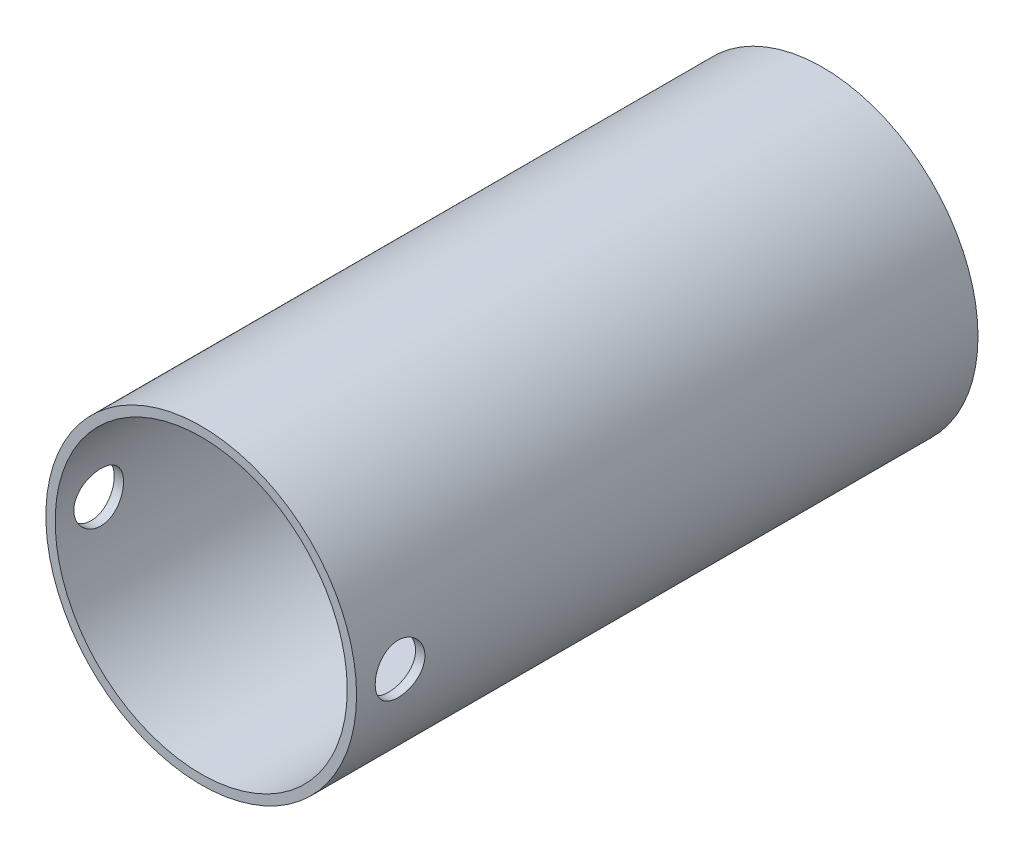
ISO-10303-21;
HEADER;
FILE_DESCRIPTION(('STEP AP214'),'2;1');
FILE_NAME('part.step','',(''),(''),'','','');
FILE_SCHEMA(('AUTOMOTIVE_DESIGN { 1 0 10303 214 1 1 1 1 }'));
ENDSEC;
DATA;
#1=APPLICATION_CONTEXT('core data for automotive mechanical design processes');
#2=APPLICATION_PROTOCOL_DEFINITION('international standard','automotive_design',2000,#1);
#3=PRODUCT_CONTEXT('',#1,'mechanical');
#4=PRODUCT('Part','Part','',(#3));
#5=PRODUCT_RELATED_PRODUCT_CATEGORY('part','',(#4));
#6=PRODUCT_DEFINITION_FORMATION('','',#4);
#7=PRODUCT_DEFINITION_CONTEXT('part definition',#1,'design');
#8=PRODUCT_DEFINITION('design','',#6,#7);
#9=PRODUCT_DEFINITION_SHAPE('','',#8);
#10=(LENGTH_UNIT() NAMED_UNIT(*) SI_UNIT(.MILLI.,.METRE.));
#11=(NAMED_UNIT(*) PLANE_ANGLE_UNIT() SI_UNIT($,.RADIAN.));
#12=(NAMED_UNIT(*) SI_UNIT($,.STERADIAN.) SOLID_ANGLE_UNIT());
#13=UNCERTAINTY_MEASURE_WITH_UNIT(LENGTH_MEASURE(1.E-05),#10,'distance_accuracy_value','');
#14=(GEOMETRIC_REPRESENTATION_CONTEXT(3) GLOBAL_UNCERTAINTY_ASSIGNED_CONTEXT((#13)) GLOBAL_UNIT_ASSIGNED_CONTEXT((#10,
#11,#12)) REPRESENTATION_CONTEXT('',''));
#15=CARTESIAN_POINT('',(0.,0.,0.));
#16=DIRECTION('',(0.,0.,1.));
#17=DIRECTION('',(1.,0.,0.));
#18=AXIS2_PLACEMENT_3D('',#15,#16,#17);
#19=CARTESIAN_POINT('',(0.,0.,100.));
#20=DIRECTION('',(0.,0.,1.));
#21=DIRECTION('',(1.,0.,0.));
#22=AXIS2_PLACEMENT_3D('',#19,#20,#21);
#23=PLANE('',#22);
#24=CARTESIAN_POINT('',(0.,0.,100.));
#25=DIRECTION('',(0.,0.,1.));
#26=DIRECTION('',(1.,0.,0.));
#27=AXIS2_PLACEMENT_3D('',#24,#25,#26);
#28=CIRCLE('',#27,25.);
#29=CARTESIAN_POINT('',(25.,0.,100.));
#30=VERTEX_POINT('',#29);
#31=EDGE_CURVE('E10',#30,#30,#28,.T.);
#32=ORIENTED_EDGE('',*,*,#31,.T.);
#33=EDGE_LOOP('',(#32));
#34=FACE_BOUND('',#33,.T.);
#35=CARTESIAN_POINT('',(0.,0.,100.));
#36=DIRECTION('',(0.,0.,1.));
#37=DIRECTION('',(1.,0.,0.));
#38=AXIS2_PLACEMENT_3D('',#35,#36,#37);
#39=CIRCLE('',#38,23.5);
#40=CARTESIAN_POINT('',(23.5,0.,100.));
#41=VERTEX_POINT('',#40);
#42=EDGE_CURVE('E54',#41,#41,#39,.T.);
#43=ORIENTED_EDGE('',*,*,#42,.F.);
#44=EDGE_LOOP('',(#43));
#45=FACE_BOUND('',#44,.T.);
#46=ADVANCED_FACE('F35',(#34,#45),#23,.T.);
#47=CARTESIAN_POINT('',(0.,0.,0.));
#48=DIRECTION('',(0.,0.,1.));
#49=DIRECTION('',(1.,0.,0.));
#50=AXIS2_PLACEMENT_3D('',#47,#48,#49);
#51=PLANE('',#50);
#52=CARTESIAN_POINT('',(0.,0.,0.));
#53=DIRECTION('',(0.,0.,1.));
#54=DIRECTION('',(1.,0.,0.));
#55=AXIS2_PLACEMENT_3D('',#52,#53,#54);
#56=CIRCLE('',#55,25.);
#57=CARTESIAN_POINT('',(25.,0.,0.));
#58=VERTEX_POINT('',#57);
#59=EDGE_CURVE('E49',#58,#58,#56,.T.);
#60=ORIENTED_EDGE('',*,*,#59,.F.);
#61=EDGE_LOOP('',(#60));
#62=FACE_BOUND('',#61,.T.);
#63=CARTESIAN_POINT('',(0.,0.,0.));
#64=DIRECTION('',(0.,0.,1.));
#65=DIRECTION('',(1.,0.,0.));
#66=AXIS2_PLACEMENT_3D('',#63,#64,#65);
#67=CIRCLE('',#66,23.5);
#68=CARTESIAN_POINT('',(23.5,0.,0.));
#69=VERTEX_POINT('',#68);
#70=EDGE_CURVE('E57',#69,#69,#67,.T.);
#71=ORIENTED_EDGE('',*,*,#70,.T.);
#72=EDGE_LOOP('',(#71));
#73=FACE_BOUND('',#72,.T.);
#74=ADVANCED_FACE('F93',(#62,#73),#51,.F.);
#75=CARTESIAN_POINT('',(0.,0.,100.));
#76=DIRECTION('',(0.,0.,-1.));
#77=DIRECTION('',(-1.,0.,0.));
#78=AXIS2_PLACEMENT_3D('',#75,#76,#77);
#79=CYLINDRICAL_SURFACE('',#78,25.);
#80=CARTESIAN_POINT('',(-25.,0.,89.));
#81=CARTESIAN_POINT('',(-24.9999962684199,0.223154040255867,89.0000090572604));
#82=CARTESIAN_POINT('',(-24.9969809352746,0.446433047720669,89.0187372145863));
#83=CARTESIAN_POINT('',(-24.9852424683713,0.886737559316477,89.093128895396));
#84=CARTESIAN_POINT('',(-24.9765139586209,1.10375697227035,89.1488272078003));
#85=CARTESIAN_POINT('',(-24.9543289280258,1.52510754225258,89.295441760892));
#86=CARTESIAN_POINT('',(-24.9408761547967,1.72944860588801,89.3863300922416));
#87=CARTESIAN_POINT('',(-24.9107247960231,2.11995168869093,89.6006735887955));
#88=CARTESIAN_POINT('',(-24.8940266144171,2.30611596589787,89.7241247017673));
#89=CARTESIAN_POINT('',(-24.8590728580675,2.65665499209349,90.0012512085248));
#90=CARTESIAN_POINT('',(-24.8408060088607,2.82084573305194,90.1551579578903));
#91=CARTESIAN_POINT('',(-24.8048607981876,3.12118820567566,90.4883289345499));
#92=CARTESIAN_POINT('',(-24.7871824725299,3.25733823381418,90.6675947013373));
#93=CARTESIAN_POINT('',(-24.7543066715639,3.49846330826428,91.0476477723041));
#94=CARTESIAN_POINT('',(-24.73912376697,3.60325799692193,91.2485508747232));
#95=CARTESIAN_POINT('',(-24.713113318991,3.77754461925213,91.6653913257376));
#96=CARTESIAN_POINT('',(-24.7022855050068,3.84703874636019,91.8813277392749));
#97=CARTESIAN_POINT('',(-24.6863228948473,3.94817517362656,92.3201607537296));
#98=CARTESIAN_POINT('',(-24.6811405060072,3.98013408900801,92.5429826219));
#99=CARTESIAN_POINT('',(-24.6769113431822,4.00627422675154,92.9908819741709));
#100=CARTESIAN_POINT('',(-24.6778641688848,4.00045791388385,93.215959310149));
#101=CARTESIAN_POINT('',(-24.6857542961208,3.9514709411627,93.6597300609979));
#102=CARTESIAN_POINT('',(-24.6926348158353,3.9086546945283,93.8784637547221));
#103=CARTESIAN_POINT('',(-24.7115162640347,3.78743887027681,94.3056021421959));
#104=CARTESIAN_POINT('',(-24.72351735552,3.70903815991344,94.5140065069018));
#105=CARTESIAN_POINT('',(-24.751349636532,3.51851577494414,94.9156385357117));
#106=CARTESIAN_POINT('',(-24.7671976186138,3.40624571635019,95.1087945993708));
#107=CARTESIAN_POINT('',(-24.8009261622985,3.15127705264726,95.4736605433707));
#108=CARTESIAN_POINT('',(-24.8188068753022,3.00857618031073,95.6453688242464));
#109=CARTESIAN_POINT('',(-24.8548362490508,2.69485968175784,95.9645176008747));
#110=CARTESIAN_POINT('',(-24.8729856400542,2.52353971091199,96.1116590141376));
#111=CARTESIAN_POINT('',(-24.9073185416933,2.15848074936105,96.375149477686));
#112=CARTESIAN_POINT('',(-24.9235020414351,1.96474163443276,96.4914983573401));
#113=CARTESIAN_POINT('',(-24.9521001139888,1.56007177661824,96.690123356228));
#114=CARTESIAN_POINT('',(-24.9645119151413,1.34912853484307,96.7723744345377));
#115=CARTESIAN_POINT('',(-24.984145511872,0.916179667879546,96.900198715852));
#116=CARTESIAN_POINT('',(-24.9913677071923,0.694174896141463,96.9457747438741));
#117=CARTESIAN_POINT('',(-24.9997549291012,0.247984110803941,96.9985529400259));
#118=CARTESIAN_POINT('',(-25.0009847993513,0.0238478673208778,97.0061659319153));
#119=CARTESIAN_POINT('',(-24.9974259501866,-0.422498743022285,96.9838952367815));
#120=CARTESIAN_POINT('',(-24.992637443611,-0.644709177708577,96.9540128757773));
#121=CARTESIAN_POINT('',(-24.9776200030468,-1.07963759647102,96.8579414036215));
#122=CARTESIAN_POINT('',(-24.9674213560511,-1.29240134880417,96.7919543493909));
#123=CARTESIAN_POINT('',(-24.9427229229552,-1.70384598117199,96.6257610629399));
#124=CARTESIAN_POINT('',(-24.9282229112907,-1.90252612198239,96.5255530361238));
#125=CARTESIAN_POINT('',(-24.8963704303685,-2.28195730225775,96.2928120013934));
#126=CARTESIAN_POINT('',(-24.8789955511662,-2.46254800619141,96.1600207279539));
#127=CARTESIAN_POINT('',(-24.8433919082741,-2.79902831279057,95.866239691275));
#128=CARTESIAN_POINT('',(-24.8251630877668,-2.95491626880566,95.7052480497435));
#129=CARTESIAN_POINT('',(-24.7896980546147,-3.23907733060002,95.3577992237921));
#130=CARTESIAN_POINT('',(-24.7724729290756,-3.36707374829441,95.1711144424264));
#131=CARTESIAN_POINT('',(-24.7411682060349,-3.5898897842024,94.7786524377593));
#132=CARTESIAN_POINT('',(-24.7270885146691,-3.68471039247671,94.5728757844458));
#133=CARTESIAN_POINT('',(-24.7037508240956,-3.83806316708309,94.1488660815636));
#134=CARTESIAN_POINT('',(-24.6944741175445,-3.89673629805033,93.9306850908043));
#135=CARTESIAN_POINT('',(-24.6817446444144,-3.9765743710892,93.487404860016));
#136=CARTESIAN_POINT('',(-24.6782914148477,-3.99774229496909,93.2623061714183));
#137=CARTESIAN_POINT('',(-24.6776187517139,-4.00189093236789,92.8143410131268));
#138=CARTESIAN_POINT('',(-24.680328256433,-3.98530695642893,92.5914785609205));
#139=CARTESIAN_POINT('',(-24.6915205651642,-3.91536035945951,92.1517573547455));
#140=CARTESIAN_POINT('',(-24.7000033545575,-3.86199783155724,91.9348985855762));
#141=CARTESIAN_POINT('',(-24.7217603172402,-3.72017043710126,91.513489299967));
#142=CARTESIAN_POINT('',(-24.7350297686206,-3.63174015540267,91.3089268847173));
#143=CARTESIAN_POINT('',(-24.7648699534816,-3.42233154568487,90.9174710646538));
#144=CARTESIAN_POINT('',(-24.7814408294783,-3.30135181249015,90.7305784231235));
#145=CARTESIAN_POINT('',(-24.8162433615403,-3.02871327199354,90.3775628383269));
#146=CARTESIAN_POINT('',(-24.834491204356,-2.87673329161919,90.2116895041992));
#147=CARTESIAN_POINT('',(-24.8704600259951,-2.54708668715906,89.907649237205));
#148=CARTESIAN_POINT('',(-24.8881808819399,-2.3694141280401,89.7694887237026));
#149=CARTESIAN_POINT('',(-24.921228112583,-1.99209669315467,89.5240050676564));
#150=CARTESIAN_POINT('',(-24.9365386530592,-1.7923200995897,89.4168822522252));
#151=CARTESIAN_POINT('',(-24.9628857500936,-1.37745033393731,89.2378774142018));
#152=CARTESIAN_POINT('',(-24.9739266312466,-1.16237292241951,89.165959713792));
#153=CARTESIAN_POINT('',(-24.9880351179278,-0.788671037676077,89.0753085225291));
#154=CARTESIAN_POINT('',(-24.9924983556635,-0.632326954997381,89.0471121944144));
#155=CARTESIAN_POINT('',(-24.9984821013428,-0.317342960303405,89.0094548542728));
#156=CARTESIAN_POINT('',(-25.0000026538317,-0.158703083077654,88.9999935586416));
#157=CARTESIAN_POINT('',(-25.,0.,89.));
#158=B_SPLINE_CURVE_WITH_KNOTS('',3,(#80,#81,#82,#83,#84,#85,#86,#87,#88,#89,#90,#91,#92,#93,
#94,#95,#96,#97,#98,#99,#100,#101,#102,#103,#104,#105,#106,#107,#108,#109,#110,#111,#112,#113,
#114,#115,#116,#117,#118,#119,#120,#121,#122,#123,#124,#125,#126,#127,#128,#129,#130,#131,#132,
#133,#134,#135,#136,#137,#138,#139,#140,#141,#142,#143,#144,#145,#146,#147,#148,#149,#150,#151,
#152,#153,#154,#155,#156,#157),.UNSPECIFIED.,.T.,.F.,(4,2,2,2,2,2,2,2,2,2,2,2,2,2,2,2,2,2,2,2,2,
2,2,2,2,2,2,2,2,2,2,2,2,2,2,2,2,2,4),(0.,0.66888209324589,1.33839449863893,2.0073769953137,
2.67627628058208,3.35046669216468,4.0246980500256,4.70273619251889,5.38073219928275,
6.05296716939299,6.72515827774053,7.39098111781001,8.05682515424385,8.72562974136637,
9.39448417474971,10.0709662667478,10.7474521072744,11.4244338727204,12.1013634864039,
12.7709514430023,13.4405157203627,14.106370604541,14.7722604124451,15.4436091856769,
16.1150026912654,16.7927805417321,17.4705381636504,18.1456357152063,18.8206795915006,
19.4879791369229,20.1552769926597,20.8219183697353,21.4885885306597,22.162552617081,
22.8366726398947,23.5150513730048,24.1927411880704,24.6684451333997,25.144141877639),.UNSPECIFIED.);
#159=CARTESIAN_POINT('',(-25.,0.,89.));
#160=VERTEX_POINT('',#159);
#161=EDGE_CURVE('E82',#160,#160,#158,.T.);
#162=ORIENTED_EDGE('',*,*,#161,.T.);
#163=EDGE_LOOP('',(#162));
#164=FACE_BOUND('',#163,.T.);
#165=CARTESIAN_POINT('',(25.,0.,89.));
#166=CARTESIAN_POINT('',(24.9999962684199,-0.223154040255867,89.0000090572604));
#167=CARTESIAN_POINT('',(24.9969809352746,-0.446433047720669,89.0187372145863));
#168=CARTESIAN_POINT('',(24.9852424683713,-0.886737559316477,89.093128895396));
#169=CARTESIAN_POINT('',(24.9765139586209,-1.10375697227035,89.1488272078003));
#170=CARTESIAN_POINT('',(24.9543289280258,-1.52510754225258,89.295441760892));
#171=CARTESIAN_POINT('',(24.9408761547967,-1.72944860588801,89.3863300922416));
#172=CARTESIAN_POINT('',(24.9107247960231,-2.11995168869093,89.6006735887955));
#173=CARTESIAN_POINT('',(24.8940266144171,-2.30611596589787,89.7241247017673));
#174=CARTESIAN_POINT('',(24.8590728580675,-2.65665499209349,90.0012512085248));
#175=CARTESIAN_POINT('',(24.8408060088607,-2.82084573305194,90.1551579578903));
#176=CARTESIAN_POINT('',(24.8048607981876,-3.12118820567566,90.4883289345499));
#177=CARTESIAN_POINT('',(24.7871824725299,-3.25733823381418,90.6675947013373));
#178=CARTESIAN_POINT('',(24.7543066715639,-3.49846330826428,91.0476477723041));
#179=CARTESIAN_POINT('',(24.73912376697,-3.60325799692193,91.2485508747232));
#180=CARTESIAN_POINT('',(24.713113318991,-3.77754461925213,91.6653913257376));
#181=CARTESIAN_POINT('',(24.7022855050068,-3.84703874636019,91.8813277392749));
#182=CARTESIAN_POINT('',(24.6863228948473,-3.94817517362656,92.3201607537296));
#183=CARTESIAN_POINT('',(24.6811405060072,-3.98013408900801,92.5429826219));
#184=CARTESIAN_POINT('',(24.6769113431822,-4.00627422675154,92.9908819741709));
#185=CARTESIAN_POINT('',(24.6778641688848,-4.00045791388385,93.215959310149));
#186=CARTESIAN_POINT('',(24.6857542961208,-3.9514709411627,93.6597300609979));
#187=CARTESIAN_POINT('',(24.6926348158353,-3.9086546945283,93.8784637547221));
#188=CARTESIAN_POINT('',(24.7115162640347,-3.78743887027681,94.3056021421959));
#189=CARTESIAN_POINT('',(24.72351735552,-3.70903815991344,94.5140065069018));
#190=CARTESIAN_POINT('',(24.751349636532,-3.51851577494414,94.9156385357117));
#191=CARTESIAN_POINT('',(24.7671976186138,-3.40624571635019,95.1087945993708));
#192=CARTESIAN_POINT('',(24.8009261622985,-3.15127705264726,95.4736605433707));
#193=CARTESIAN_POINT('',(24.8188068753022,-3.00857618031073,95.6453688242464));
#194=CARTESIAN_POINT('',(24.8548362490508,-2.69485968175784,95.9645176008747));
#195=CARTESIAN_POINT('',(24.8729856400542,-2.52353971091199,96.1116590141376));
#196=CARTESIAN_POINT('',(24.9073185416933,-2.15848074936105,96.375149477686));
#197=CARTESIAN_POINT('',(24.9235020414351,-1.96474163443276,96.4914983573401));
#198=CARTESIAN_POINT('',(24.9521001139888,-1.56007177661824,96.690123356228));
#199=CARTESIAN_POINT('',(24.9645119151413,-1.34912853484307,96.7723744345377));
#200=CARTESIAN_POINT('',(24.984145511872,-0.916179667879546,96.900198715852));
#201=CARTESIAN_POINT('',(24.9913677071923,-0.694174896141463,96.9457747438741));
#202=CARTESIAN_POINT('',(24.9997549291012,-0.247984110803941,96.9985529400259));
#203=CARTESIAN_POINT('',(25.0009847993513,-0.0238478673208778,97.0061659319153));
#204=CARTESIAN_POINT('',(24.9974259501866,0.422498743022285,96.9838952367815));
#205=CARTESIAN_POINT('',(24.992637443611,0.644709177708577,96.9540128757773));
#206=CARTESIAN_POINT('',(24.9776200030468,1.07963759647102,96.8579414036215));
#207=CARTESIAN_POINT('',(24.9674213560511,1.29240134880417,96.7919543493909));
#208=CARTESIAN_POINT('',(24.9427229229552,1.70384598117199,96.6257610629399));
#209=CARTESIAN_POINT('',(24.9282229112907,1.90252612198239,96.5255530361238));
#210=CARTESIAN_POINT('',(24.8963704303685,2.28195730225775,96.2928120013934));
#211=CARTESIAN_POINT('',(24.8789955511662,2.46254800619141,96.1600207279539));
#212=CARTESIAN_POINT('',(24.8433919082741,2.79902831279057,95.866239691275));
#213=CARTESIAN_POINT('',(24.8251630877668,2.95491626880566,95.7052480497435));
#214=CARTESIAN_POINT('',(24.7896980546147,3.23907733060002,95.3577992237921));
#215=CARTESIAN_POINT('',(24.7724729290756,3.36707374829441,95.1711144424264));
#216=CARTESIAN_POINT('',(24.7411682060349,3.5898897842024,94.7786524377593));
#217=CARTESIAN_POINT('',(24.7270885146691,3.68471039247671,94.5728757844458));
#218=CARTESIAN_POINT('',(24.7037508240956,3.83806316708309,94.1488660815636));
#219=CARTESIAN_POINT('',(24.6944741175445,3.89673629805033,93.9306850908043));
#220=CARTESIAN_POINT('',(24.6817446444144,3.9765743710892,93.487404860016));
#221=CARTESIAN_POINT('',(24.6782914148477,3.99774229496909,93.2623061714183));
#222=CARTESIAN_POINT('',(24.6776187517139,4.00189093236789,92.8143410131268));
#223=CARTESIAN_POINT('',(24.680328256433,3.98530695642893,92.5914785609205));
#224=CARTESIAN_POINT('',(24.6915205651642,3.91536035945951,92.1517573547455));
#225=CARTESIAN_POINT('',(24.7000033545575,3.86199783155724,91.9348985855762));
#226=CARTESIAN_POINT('',(24.7217603172402,3.72017043710126,91.513489299967));
#227=CARTESIAN_POINT('',(24.7350297686206,3.63174015540267,91.3089268847173));
#228=CARTESIAN_POINT('',(24.7648699534816,3.42233154568487,90.9174710646538));
#229=CARTESIAN_POINT('',(24.7814408294783,3.30135181249015,90.7305784231235));
#230=CARTESIAN_POINT('',(24.8162433615403,3.02871327199354,90.3775628383269));
#231=CARTESIAN_POINT('',(24.834491204356,2.87673329161919,90.2116895041992));
#232=CARTESIAN_POINT('',(24.8704600259951,2.54708668715906,89.907649237205));
#233=CARTESIAN_POINT('',(24.8881808819399,2.3694141280401,89.7694887237026));
#234=CARTESIAN_POINT('',(24.921228112583,1.99209669315467,89.5240050676564));
#235=CARTESIAN_POINT('',(24.9365386530592,1.7923200995897,89.4168822522252));
#236=CARTESIAN_POINT('',(24.9628857500936,1.37745033393731,89.2378774142018));
#237=CARTESIAN_POINT('',(24.9739266312466,1.16237292241951,89.165959713792));
#238=CARTESIAN_POINT('',(24.9880351179278,0.788671037676077,89.0753085225291));
#239=CARTESIAN_POINT('',(24.9924983556635,0.632326954997381,89.0471121944144));
#240=CARTESIAN_POINT('',(24.9984821013428,0.317342960303405,89.0094548542728));
#241=CARTESIAN_POINT('',(25.0000026538317,0.158703083077654,88.9999935586416));
#242=CARTESIAN_POINT('',(25.,0.,89.));
#243=B_SPLINE_CURVE_WITH_KNOTS('',3,(#165,#166,#167,#168,#169,#170,#171,#172,#173,#174,#175,
#176,#177,#178,#179,#180,#181,#182,#183,#184,#185,#186,#187,#188,#189,#190,#191,#192,#193,#194,
#195,#196,#197,#198,#199,#200,#201,#202,#203,#204,#205,#206,#207,#208,#209,#210,#211,#212,#213,
#214,#215,#216,#217,#218,#219,#220,#221,#222,#223,#224,#225,#226,#227,#228,#229,#230,#231,#232,
#233,#234,#235,#236,#237,#238,#239,#240,#241,#242),.UNSPECIFIED.,.T.,.F.,(4,2,2,2,2,2,2,2,2,2,2,
2,2,2,2,2,2,2,2,2,2,2,2,2,2,2,2,2,2,2,2,2,2,2,2,2,2,2,4),(0.,0.66888209324589,1.33839449863893,
2.0073769953137,2.67627628058208,3.35046669216468,4.0246980500256,4.70273619251889,
5.38073219928275,6.05296716939299,6.72515827774053,7.39098111781001,8.05682515424385,
8.72562974136637,9.39448417474971,10.0709662667478,10.7474521072744,11.4244338727204,
12.1013634864039,12.7709514430023,13.4405157203627,14.106370604541,14.7722604124451,
15.4436091856769,16.1150026912654,16.7927805417321,17.4705381636504,18.1456357152063,
18.8206795915006,19.4879791369229,20.1552769926597,20.8219183697353,21.4885885306597,
22.162552617081,22.8366726398947,23.5150513730048,24.1927411880704,24.6684451333997,
25.144141877639),.UNSPECIFIED.);
#244=CARTESIAN_POINT('',(25.,0.,89.));
#245=VERTEX_POINT('',#244);
#246=EDGE_CURVE('E77',#245,#245,#243,.T.);
#247=ORIENTED_EDGE('',*,*,#246,.T.);
#248=EDGE_LOOP('',(#247));
#249=FACE_BOUND('',#248,.T.);
#250=ORIENTED_EDGE('',*,*,#31,.F.);
#251=EDGE_LOOP('',(#250));
#252=FACE_BOUND('',#251,.T.);
#253=ORIENTED_EDGE('',*,*,#59,.T.);
#254=EDGE_LOOP('',(#253));
#255=FACE_BOUND('',#254,.T.);
#256=ADVANCED_FACE('F37',(#164,#249,#252,#255),#79,.T.);
#257=CARTESIAN_POINT('',(0.,0.,100.));
#258=DIRECTION('',(0.,0.,-1.));
#259=DIRECTION('',(-1.,0.,0.));
#260=AXIS2_PLACEMENT_3D('',#257,#258,#259);
#261=CYLINDRICAL_SURFACE('',#260,23.5);
#262=CARTESIAN_POINT('',(-23.5,0.,97.));
#263=CARTESIAN_POINT('',(-23.4999961351286,-0.222954998649433,96.9999911234054));
#264=CARTESIAN_POINT('',(-23.4967940862922,-0.446029926717368,96.9812961758851));
#265=CARTESIAN_POINT('',(-23.4843288655472,-0.885918424265959,96.9070441892489));
#266=CARTESIAN_POINT('',(-23.475060194433,-1.10272612633695,96.8514537048281));
#267=CARTESIAN_POINT('',(-23.4515008823841,-1.52365265640741,96.7051417286286));
#268=CARTESIAN_POINT('',(-23.4372144202602,-1.72778187707003,96.6144494631851));
#269=CARTESIAN_POINT('',(-23.4051886115635,-2.11790118237274,96.4005859468545));
#270=CARTESIAN_POINT('',(-23.3874496410455,-2.3038932392435,96.2774182327465));
#271=CARTESIAN_POINT('',(-23.3502864942069,-2.65433469521942,96.0007964509293));
#272=CARTESIAN_POINT('',(-23.330848711002,-2.81857738434776,95.8470823106062));
#273=CARTESIAN_POINT('',(-23.2925823264101,-3.11907184262601,95.5142908024996));
#274=CARTESIAN_POINT('',(-23.2737537643659,-3.25532180706411,95.3352118006814));
#275=CARTESIAN_POINT('',(-23.2387058223116,-3.49679671363377,94.9553473095983));
#276=CARTESIAN_POINT('',(-23.2225040188346,-3.60181628991354,94.7544295085445));
#277=CARTESIAN_POINT('',(-23.1947333026796,-3.7765357960084,94.337482601702));
#278=CARTESIAN_POINT('',(-23.1831640632153,-3.84623821722871,94.1214545630704));
#279=CARTESIAN_POINT('',(-23.1661040930935,-3.94769154255555,93.682614065599));
#280=CARTESIAN_POINT('',(-23.1605561444724,-3.97979992294877,93.4598865166346));
#281=CARTESIAN_POINT('',(-23.1559939270718,-4.00626228643161,93.0121414369603));
#282=CARTESIAN_POINT('',(-23.1569791760287,-4.00061905624618,92.7871240765027));
#283=CARTESIAN_POINT('',(-23.1653198156205,-3.95202935157278,92.3437447652373));
#284=CARTESIAN_POINT('',(-23.1726064933372,-3.90948524198854,92.1253372382884));
#285=CARTESIAN_POINT('',(-23.1926213469856,-3.78893325775148,91.6988060101641));
#286=CARTESIAN_POINT('',(-23.2053497168509,-3.7109241191728,91.4906826757966));
#287=CARTESIAN_POINT('',(-23.2348876258265,-3.52125088659836,91.0894275678232));
#288=CARTESIAN_POINT('',(-23.2517172534158,-3.4094204610526,90.8963759587405));
#289=CARTESIAN_POINT('',(-23.2875475673208,-3.15539712729966,90.5316255686953));
#290=CARTESIAN_POINT('',(-23.3065484361585,-3.01320166563223,90.3599285854112));
#291=CARTESIAN_POINT('',(-23.3448818305709,-2.70029609657366,90.0404329039277));
#292=CARTESIAN_POINT('',(-23.364215466957,-2.52924093534459,89.8929720667721));
#293=CARTESIAN_POINT('',(-23.4008090064143,-2.16463656855721,89.6287940706403));
#294=CARTESIAN_POINT('',(-23.4180688950353,-1.97108720627544,89.512077125884));
#295=CARTESIAN_POINT('',(-23.4485963076715,-1.56666528933581,89.3126662717293));
#296=CARTESIAN_POINT('',(-23.4618602259385,-1.35577730631994,89.2300030660273));
#297=CARTESIAN_POINT('',(-23.4828724602236,-0.922834780170311,89.1013642682943));
#298=CARTESIAN_POINT('',(-23.4906212577428,-0.70078121366775,89.0553854734647));
#299=CARTESIAN_POINT('',(-23.4996651989652,-0.254721984498356,89.001880663809));
#300=CARTESIAN_POINT('',(-23.5010381565431,-0.0307734618617975,88.9938909823033));
#301=CARTESIAN_POINT('',(-23.4973891440763,0.415261782441234,89.0153538136113));
#302=CARTESIAN_POINT('',(-23.4923674310489,0.637348578573919,89.0448048215923));
#303=CARTESIAN_POINT('',(-23.4765415429976,1.0719177111528,89.1399273868037));
#304=CARTESIAN_POINT('',(-23.4657741592896,1.28445193008453,89.2053685685297));
#305=CARTESIAN_POINT('',(-23.4396593490892,1.69553253378074,89.3703676567915));
#306=CARTESIAN_POINT('',(-23.4243116563033,1.89407810443211,89.4699275469983));
#307=CARTESIAN_POINT('',(-23.3905454787521,2.2735537534882,89.7013940422118));
#308=CARTESIAN_POINT('',(-23.3721000922558,2.45430534975698,89.8335892573339));
#309=CARTESIAN_POINT('',(-23.3342636353432,2.79122487814876,90.1261779136095));
#310=CARTESIAN_POINT('',(-23.3148724931723,2.94739094114853,90.2865734967449));
#311=CARTESIAN_POINT('',(-23.277077344905,3.23243218446675,90.6330926720173));
#312=CARTESIAN_POINT('',(-23.2586863005076,3.36099356101612,90.8194760328803));
#313=CARTESIAN_POINT('',(-23.2252186830396,3.5849820743906,91.211465832914));
#314=CARTESIAN_POINT('',(-23.2101420016859,3.68041029376234,91.4170716437586));
#315=CARTESIAN_POINT('',(-23.185108139055,3.83495823512733,91.8408056653004));
#316=CARTESIAN_POINT('',(-23.1751292479311,3.89423213971422,92.0588763002944));
#317=CARTESIAN_POINT('',(-23.1613671108405,3.97527263007388,92.502063353464));
#318=CARTESIAN_POINT('',(-23.1575833007173,3.99704263115886,92.7271791281692));
#319=CARTESIAN_POINT('',(-23.1566647672302,4.00235897632119,93.1749312126083));
#320=CARTESIAN_POINT('',(-23.159444094377,3.98639941584934,93.3975616330272));
#321=CARTESIAN_POINT('',(-23.1711499464907,3.91778023320935,93.836919665102));
#322=CARTESIAN_POINT('',(-23.1800764490234,3.86512074497707,94.0536472982971));
#323=CARTESIAN_POINT('',(-23.2030376165417,3.72478898391622,94.4748444201076));
#324=CARTESIAN_POINT('',(-23.2170658119916,3.63716104149346,94.6793290534584));
#325=CARTESIAN_POINT('',(-23.2486557077146,3.42943104467312,95.0707744502551));
#326=CARTESIAN_POINT('',(-23.266217595541,3.30932726648187,95.2577342827877));
#327=CARTESIAN_POINT('',(-23.3031676675959,3.03829888463308,95.6113159061784));
#328=CARTESIAN_POINT('',(-23.3225757565238,2.88701139169374,95.7776574952754));
#329=CARTESIAN_POINT('',(-23.3608743029626,2.55867410396086,96.0827613876381));
#330=CARTESIAN_POINT('',(-23.3797646401225,2.38161837871536,96.2215173247399));
#331=CARTESIAN_POINT('',(-23.4150579884149,2.00524571228135,96.4684323196135));
#332=CARTESIAN_POINT('',(-23.4314420156426,1.80577698434031,96.576362754232));
#333=CARTESIAN_POINT('',(-23.4596919795831,1.3913393722722,96.7570162183415));
#334=CARTESIAN_POINT('',(-23.471562372415,1.17638602620318,96.8297739916661));
#335=CARTESIAN_POINT('',(-23.4868845932466,0.800523999238165,96.9223886011852));
#336=CARTESIAN_POINT('',(-23.4917763439135,0.641877509830311,96.9514457657609));
#337=CARTESIAN_POINT('',(-23.4983354140688,0.322174860701915,96.9902544946944));
#338=CARTESIAN_POINT('',(-23.5000027929548,0.161118745425366,97.0000064146837));
#339=CARTESIAN_POINT('',(-23.5,0.,97.));
#340=B_SPLINE_CURVE_WITH_KNOTS('',3,(#262,#263,#264,#265,#266,#267,#268,#269,#270,#271,#272,
#273,#274,#275,#276,#277,#278,#279,#280,#281,#282,#283,#284,#285,#286,#287,#288,#289,#290,#291,
#292,#293,#294,#295,#296,#297,#298,#299,#300,#301,#302,#303,#304,#305,#306,#307,#308,#309,#310,
#311,#312,#313,#314,#315,#316,#317,#318,#319,#320,#321,#322,#323,#324,#325,#326,#327,#328,#329,
#330,#331,#332,#333,#334,#335,#336,#337,#338,#339),.UNSPECIFIED.,.T.,.F.,(4,2,2,2,2,2,2,2,2,2,2,
2,2,2,2,2,2,2,2,2,2,2,2,2,2,2,2,2,2,2,2,2,2,2,2,2,2,2,4),(0.,0.668276014807561,1.33715864167181,
2.00548553950328,2.67373968240636,3.3479479519828,4.02219967463837,4.7007918080238,
5.37933606429546,6.05137434805536,6.72336302425802,7.38811520141467,8.05289107130112,
8.72099096211514,9.38914705700504,10.0659459720947,10.7427496029167,11.4201621281422,
12.0975155041736,12.7665800149935,13.4356176353263,14.1004217218991,14.7652644669185,
15.4362117193162,16.1072099560915,16.7854735060472,17.4637148932789,18.1390432726605,
18.8143101496653,19.4807830095301,20.1472534371241,20.812881633599,21.478545168071,
22.1524432850236,22.8264967428184,23.5054268020837,24.1836848314685,24.6666243362424,
25.1495549444633),.UNSPECIFIED.);
#341=CARTESIAN_POINT('',(-23.5,0.,97.));
#342=VERTEX_POINT('',#341);
#343=EDGE_CURVE('E40',#342,#342,#340,.T.);
#344=ORIENTED_EDGE('',*,*,#343,.F.);
#345=EDGE_LOOP('',(#344));
#346=FACE_BOUND('',#345,.T.);
#347=CARTESIAN_POINT('',(23.5,0.,89.));
#348=CARTESIAN_POINT('',(23.4999961351286,-0.222954998649433,89.0000088765946));
#349=CARTESIAN_POINT('',(23.4967940862922,-0.446029926717368,89.0187038241149));
#350=CARTESIAN_POINT('',(23.4843288655472,-0.885918424265959,89.0929558107511));
#351=CARTESIAN_POINT('',(23.475060194433,-1.10272612633695,89.1485462951719));
#352=CARTESIAN_POINT('',(23.4515008823841,-1.52365265640741,89.2948582713714));
#353=CARTESIAN_POINT('',(23.4372144202602,-1.72778187707003,89.3855505368149));
#354=CARTESIAN_POINT('',(23.4051886115635,-2.11790118237274,89.5994140531455));
#355=CARTESIAN_POINT('',(23.3874496410455,-2.3038932392435,89.7225817672535));
#356=CARTESIAN_POINT('',(23.3502864942069,-2.65433469521942,89.9992035490707));
#357=CARTESIAN_POINT('',(23.330848711002,-2.81857738434776,90.1529176893938));
#358=CARTESIAN_POINT('',(23.2925823264101,-3.11907184262601,90.4857091975004));
#359=CARTESIAN_POINT('',(23.2737537643659,-3.25532180706411,90.6647881993186));
#360=CARTESIAN_POINT('',(23.2387058223116,-3.49679671363376,91.0446526904017));
#361=CARTESIAN_POINT('',(23.2225040188346,-3.60181628991354,91.2455704914555));
#362=CARTESIAN_POINT('',(23.1947333026796,-3.7765357960084,91.662517398298));
#363=CARTESIAN_POINT('',(23.1831640632153,-3.84623821722871,91.8785454369296));
#364=CARTESIAN_POINT('',(23.1661040930935,-3.94769154255555,92.317385934401));
#365=CARTESIAN_POINT('',(23.1605561444724,-3.97979992294877,92.5401134833654));
#366=CARTESIAN_POINT('',(23.1559939270718,-4.00626228643161,92.9878585630397));
#367=CARTESIAN_POINT('',(23.1569791760287,-4.00061905624618,93.2128759234973));
#368=CARTESIAN_POINT('',(23.1653198156205,-3.95202935157278,93.6562552347627));
#369=CARTESIAN_POINT('',(23.1726064933372,-3.90948524198854,93.8746627617116));
#370=CARTESIAN_POINT('',(23.1926213469856,-3.78893325775148,94.3011939898359));
#371=CARTESIAN_POINT('',(23.2053497168509,-3.7109241191728,94.5093173242034));
#372=CARTESIAN_POINT('',(23.2348876258265,-3.52125088659836,94.9105724321768));
#373=CARTESIAN_POINT('',(23.2517172534158,-3.4094204610526,95.1036240412595));
#374=CARTESIAN_POINT('',(23.2875475673208,-3.15539712729966,95.4683744313047));
#375=CARTESIAN_POINT('',(23.3065484361585,-3.01320166563223,95.6400714145888));
#376=CARTESIAN_POINT('',(23.3448818305709,-2.70029609657366,95.9595670960723));
#377=CARTESIAN_POINT('',(23.364215466957,-2.52924093534459,96.1070279332279));
#378=CARTESIAN_POINT('',(23.4008090064143,-2.16463656855721,96.3712059293597));
#379=CARTESIAN_POINT('',(23.4180688950353,-1.97108720627544,96.487922874116));
#380=CARTESIAN_POINT('',(23.4485963076715,-1.56666528933581,96.6873337282707));
#381=CARTESIAN_POINT('',(23.4618602259385,-1.35577730631994,96.7699969339727));
#382=CARTESIAN_POINT('',(23.4828724602236,-0.922834780170311,96.8986357317057));
#383=CARTESIAN_POINT('',(23.4906212577428,-0.700781213667749,96.9446145265353));
#384=CARTESIAN_POINT('',(23.4996651989652,-0.254721984498356,96.998119336191));
#385=CARTESIAN_POINT('',(23.5010381565431,-0.030773461861798,97.0061090176967));
#386=CARTESIAN_POINT('',(23.4973891440763,0.415261782441233,96.9846461863887));
#387=CARTESIAN_POINT('',(23.4923674310489,0.637348578573919,96.9551951784077));
#388=CARTESIAN_POINT('',(23.4765415429976,1.0719177111528,96.8600726131963));
#389=CARTESIAN_POINT('',(23.4657741592896,1.28445193008453,96.7946314314703));
#390=CARTESIAN_POINT('',(23.4396593490892,1.69553253378074,96.6296323432085));
#391=CARTESIAN_POINT('',(23.4243116563033,1.89407810443211,96.5300724530017));
#392=CARTESIAN_POINT('',(23.3905454787521,2.2735537534882,96.2986059577882));
#393=CARTESIAN_POINT('',(23.3721000922558,2.45430534975699,96.1664107426661));
#394=CARTESIAN_POINT('',(23.3342636353432,2.79122487814877,95.8738220863905));
#395=CARTESIAN_POINT('',(23.3148724931723,2.94739094114853,95.7134265032551));
#396=CARTESIAN_POINT('',(23.277077344905,3.23243218446675,95.3669073279827));
#397=CARTESIAN_POINT('',(23.2586863005076,3.36099356101612,95.1805239671197));
#398=CARTESIAN_POINT('',(23.2252186830396,3.58498207439061,94.788534167086));
#399=CARTESIAN_POINT('',(23.2101420016859,3.68041029376234,94.5829283562414));
#400=CARTESIAN_POINT('',(23.185108139055,3.83495823512732,94.1591943346996));
#401=CARTESIAN_POINT('',(23.1751292479311,3.89423213971421,93.9411236997057));
#402=CARTESIAN_POINT('',(23.1613671108405,3.97527263007388,93.4979366465361));
#403=CARTESIAN_POINT('',(23.1575833007173,3.99704263115886,93.2728208718309));
#404=CARTESIAN_POINT('',(23.1566647672302,4.00235897632119,92.8250687873917));
#405=CARTESIAN_POINT('',(23.159444094377,3.98639941584934,92.6024383669728));
#406=CARTESIAN_POINT('',(23.1711499464907,3.91778023320935,92.163080334898));
#407=CARTESIAN_POINT('',(23.1800764490234,3.86512074497707,91.9463527017029));
#408=CARTESIAN_POINT('',(23.2030376165417,3.72478898391622,91.5251555798924));
#409=CARTESIAN_POINT('',(23.2170658119916,3.63716104149346,91.3206709465416));
#410=CARTESIAN_POINT('',(23.2486557077146,3.42943104467312,90.9292255497449));
#411=CARTESIAN_POINT('',(23.266217595541,3.30932726648187,90.7422657172123));
#412=CARTESIAN_POINT('',(23.3031676675959,3.03829888463308,90.3886840938216));
#413=CARTESIAN_POINT('',(23.3225757565238,2.88701139169374,90.2223425047246));
#414=CARTESIAN_POINT('',(23.3608743029626,2.55867410396086,89.9172386123619));
#415=CARTESIAN_POINT('',(23.3797646401225,2.38161837871536,89.7784826752601));
#416=CARTESIAN_POINT('',(23.4150579884149,2.00524571228135,89.5315676803865));
#417=CARTESIAN_POINT('',(23.4314420156426,1.80577698434031,89.423637245768));
#418=CARTESIAN_POINT('',(23.4596919795831,1.39133937227221,89.2429837816585));
#419=CARTESIAN_POINT('',(23.471562372415,1.17638602620319,89.1702260083339));
#420=CARTESIAN_POINT('',(23.4868845932466,0.800523999238165,89.0776113988148));
#421=CARTESIAN_POINT('',(23.4917763439135,0.641877509830311,89.0485542342391));
#422=CARTESIAN_POINT('',(23.4983354140688,0.322174860701915,89.0097455053056));
#423=CARTESIAN_POINT('',(23.5000027929548,0.161118745425366,88.9999935853163));
#424=CARTESIAN_POINT('',(23.5,0.,89.));
#425=B_SPLINE_CURVE_WITH_KNOTS('',3,(#347,#348,#349,#350,#351,#352,#353,#354,#355,#356,#357,
#358,#359,#360,#361,#362,#363,#364,#365,#366,#367,#368,#369,#370,#371,#372,#373,#374,#375,#376,
#377,#378,#379,#380,#381,#382,#383,#384,#385,#386,#387,#388,#389,#390,#391,#392,#393,#394,#395,
#396,#397,#398,#399,#400,#401,#402,#403,#404,#405,#406,#407,#408,#409,#410,#411,#412,#413,#414,
#415,#416,#417,#418,#419,#420,#421,#422,#423,#424),.UNSPECIFIED.,.T.,.F.,(4,2,2,2,2,2,2,2,2,2,2,
2,2,2,2,2,2,2,2,2,2,2,2,2,2,2,2,2,2,2,2,2,2,2,2,2,2,2,4),(0.,0.668276014807561,1.33715864167181,
2.00548553950328,2.67373968240636,3.3479479519828,4.02219967463837,4.70079180802378,
5.37933606429546,6.05137434805536,6.72336302425802,7.38811520141467,8.05289107130112,
8.72099096211514,9.38914705700504,10.0659459720947,10.7427496029167,11.4201621281422,
12.0975155041736,12.7665800149935,13.4356176353263,14.1004217218991,14.7652644669185,
15.4362117193162,16.1072099560915,16.7854735060472,17.4637148932789,18.1390432726605,
18.8143101496653,19.4807830095301,20.1472534371241,20.812881633599,21.478545168071,
22.1524432850236,22.8264967428184,23.5054268020837,24.1836848314685,24.6666243362424,
25.1495549444633),.UNSPECIFIED.);
#426=CARTESIAN_POINT('',(23.5,0.,89.));
#427=VERTEX_POINT('',#426);
#428=EDGE_CURVE('E59',#427,#427,#425,.T.);
#429=ORIENTED_EDGE('',*,*,#428,.F.);
#430=EDGE_LOOP('',(#429));
#431=FACE_BOUND('',#430,.T.);
#432=ORIENTED_EDGE('',*,*,#42,.T.);
#433=EDGE_LOOP('',(#432));
#434=FACE_BOUND('',#433,.T.);
#435=ORIENTED_EDGE('',*,*,#70,.F.);
#436=EDGE_LOOP('',(#435));
#437=FACE_BOUND('',#436,.T.);
#438=ADVANCED_FACE('F64',(#346,#431,#434,#437),#261,.F.);
#439=CARTESIAN_POINT('',(-25.,0.,93.));
#440=DIRECTION('',(1.,0.,0.));
#441=DIRECTION('',(0.,0.,-1.));
#442=AXIS2_PLACEMENT_3D('',#439,#440,#441);
#443=CYLINDRICAL_SURFACE('',#442,4.00000000000001);
#444=ORIENTED_EDGE('',*,*,#428,.T.);
#445=EDGE_LOOP('',(#444));
#446=FACE_BOUND('',#445,.T.);
#447=ORIENTED_EDGE('',*,*,#246,.F.);
#448=EDGE_LOOP('',(#447));
#449=FACE_BOUND('',#448,.T.);
#450=ADVANCED_FACE('F70',(#446,#449),#443,.F.);
#451=ORIENTED_EDGE('',*,*,#343,.T.);
#452=EDGE_LOOP('',(#451));
#453=FACE_BOUND('',#452,.T.);
#454=ORIENTED_EDGE('',*,*,#161,.F.);
#455=EDGE_LOOP('',(#454));
#456=FACE_BOUND('',#455,.T.);
#457=ADVANCED_FACE('F67',(#453,#456),#443,.F.);
#458=CLOSED_SHELL('',(#46,#74,#256,#438,#450,#457));
#459=MANIFOLD_SOLID_BREP('B2',#458);
#460=ADVANCED_BREP_SHAPE_REPRESENTATION('',(#18,#459),#14);
#461=SHAPE_DEFINITION_REPRESENTATION(#9,#460);
ENDSEC;
END-ISO-10303-21;
